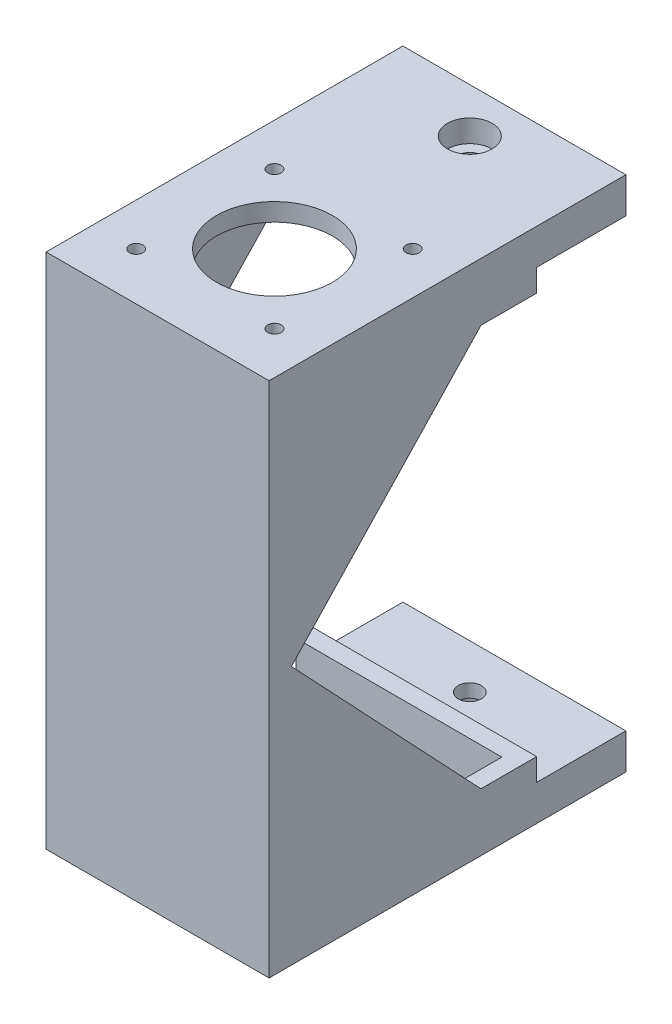
ISO-10303-21;
HEADER;
FILE_DESCRIPTION(('STEP AP214'),'2;1');
FILE_NAME('part.step','',(''),(''),'','','');
FILE_SCHEMA(('AUTOMOTIVE_DESIGN { 1 0 10303 214 1 1 1 1 }'));
ENDSEC;
DATA;
#1=APPLICATION_CONTEXT('core data for automotive mechanical design processes');
#2=APPLICATION_PROTOCOL_DEFINITION('international standard','automotive_design',2000,#1);
#3=PRODUCT_CONTEXT('',#1,'mechanical');
#4=PRODUCT('Part','Part','',(#3));
#5=PRODUCT_RELATED_PRODUCT_CATEGORY('part','',(#4));
#6=PRODUCT_DEFINITION_FORMATION('','',#4);
#7=PRODUCT_DEFINITION_CONTEXT('part definition',#1,'design');
#8=PRODUCT_DEFINITION('design','',#6,#7);
#9=PRODUCT_DEFINITION_SHAPE('','',#8);
#10=(LENGTH_UNIT() NAMED_UNIT(*) SI_UNIT(.MILLI.,.METRE.));
#11=(NAMED_UNIT(*) PLANE_ANGLE_UNIT() SI_UNIT($,.RADIAN.));
#12=(NAMED_UNIT(*) SI_UNIT($,.STERADIAN.) SOLID_ANGLE_UNIT());
#13=UNCERTAINTY_MEASURE_WITH_UNIT(LENGTH_MEASURE(1.E-05),#10,'distance_accuracy_value','');
#14=(GEOMETRIC_REPRESENTATION_CONTEXT(3) GLOBAL_UNCERTAINTY_ASSIGNED_CONTEXT((#13)) GLOBAL_UNIT_ASSIGNED_CONTEXT((#10,
#11,#12)) REPRESENTATION_CONTEXT('',''));
#15=CARTESIAN_POINT('',(0.,0.,0.));
#16=DIRECTION('',(0.,0.,1.));
#17=DIRECTION('',(1.,0.,0.));
#18=AXIS2_PLACEMENT_3D('',#15,#16,#17);
#19=CARTESIAN_POINT('',(25.,-192.,10.));
#20=DIRECTION('',(0.,1.,0.));
#21=DIRECTION('',(0.,0.,1.));
#22=AXIS2_PLACEMENT_3D('',#19,#20,#21);
#23=CYLINDRICAL_SURFACE('',#22,2.6);
#24=CARTESIAN_POINT('',(25.,-100.,10.));
#25=DIRECTION('',(0.,1.,0.));
#26=DIRECTION('',(0.,0.,1.));
#27=AXIS2_PLACEMENT_3D('',#24,#25,#26);
#28=CIRCLE('',#27,2.6);
#29=CARTESIAN_POINT('',(25.,-100.,12.6));
#30=VERTEX_POINT('',#29);
#31=EDGE_CURVE('E353',#30,#30,#28,.T.);
#32=ORIENTED_EDGE('',*,*,#31,.T.);
#33=EDGE_LOOP('',(#32));
#34=FACE_BOUND('',#33,.T.);
#35=CARTESIAN_POINT('',(25.,-103.,10.));
#36=DIRECTION('',(0.,-1.,0.));
#37=DIRECTION('',(0.,0.,-1.));
#38=AXIS2_PLACEMENT_3D('',#35,#36,#37);
#39=CIRCLE('',#38,2.6);
#40=CARTESIAN_POINT('',(25.,-103.,7.4));
#41=VERTEX_POINT('',#40);
#42=EDGE_CURVE('E74',#41,#41,#39,.F.);
#43=ORIENTED_EDGE('',*,*,#42,.F.);
#44=EDGE_LOOP('',(#43));
#45=FACE_BOUND('',#44,.T.);
#46=ADVANCED_FACE('F70',(#34,#45),#23,.F.);
#47=CARTESIAN_POINT('',(25.,50.,10.));
#48=DIRECTION('',(0.,-1.,0.));
#49=DIRECTION('',(0.,0.,-1.));
#50=AXIS2_PLACEMENT_3D('',#47,#48,#49);
#51=CYLINDRICAL_SURFACE('',#50,2.6);
#52=CARTESIAN_POINT('',(25.,0.,10.));
#53=DIRECTION('',(0.,-1.,0.));
#54=DIRECTION('',(0.,0.,-1.));
#55=AXIS2_PLACEMENT_3D('',#52,#53,#54);
#56=CIRCLE('',#55,2.6);
#57=CARTESIAN_POINT('',(25.,0.,7.4));
#58=VERTEX_POINT('',#57);
#59=EDGE_CURVE('E356',#58,#58,#56,.T.);
#60=ORIENTED_EDGE('',*,*,#59,.T.);
#61=EDGE_LOOP('',(#60));
#62=FACE_BOUND('',#61,.T.);
#63=CARTESIAN_POINT('',(25.,3.,10.));
#64=DIRECTION('',(0.,1.,0.));
#65=DIRECTION('',(0.,0.,1.));
#66=AXIS2_PLACEMENT_3D('',#63,#64,#65);
#67=CIRCLE('',#66,2.6);
#68=CARTESIAN_POINT('',(25.,3.,12.6));
#69=VERTEX_POINT('',#68);
#70=EDGE_CURVE('E357',#69,#69,#67,.F.);
#71=ORIENTED_EDGE('',*,*,#70,.F.);
#72=EDGE_LOOP('',(#71));
#73=FACE_BOUND('',#72,.T.);
#74=ADVANCED_FACE('F600',(#62,#73),#51,.F.);
#75=CARTESIAN_POINT('',(0.,-36.,75.));
#76=DIRECTION('',(0.,0.,1.));
#77=DIRECTION('',(1.,0.,0.));
#78=AXIS2_PLACEMENT_3D('',#75,#76,#77);
#79=PLANE('',#78);
#80=DIRECTION('',(0.,1.,0.));
#81=VECTOR('',#80,1.);
#82=CARTESIAN_POINT('',(46.2,0.,75.));
#83=LINE('',#82,#81);
#84=CARTESIAN_POINT('',(46.2,-104.,75.));
#85=VERTEX_POINT('',#84);
#86=CARTESIAN_POINT('',(46.2,-50.,75.));
#87=VERTEX_POINT('',#86);
#88=EDGE_CURVE('E435',#85,#87,#83,.T.);
#89=ORIENTED_EDGE('',*,*,#88,.F.);
#90=DIRECTION('',(-1.,0.,0.));
#91=VECTOR('',#90,1.);
#92=CARTESIAN_POINT('',(50.,-104.,75.));
#93=LINE('',#92,#91);
#94=CARTESIAN_POINT('',(0.,-104.,75.));
#95=VERTEX_POINT('',#94);
#96=EDGE_CURVE('E291',#85,#95,#93,.T.);
#97=ORIENTED_EDGE('',*,*,#96,.T.);
#98=DIRECTION('',(0.,1.,0.));
#99=VECTOR('',#98,1.);
#100=CARTESIAN_POINT('',(0.,-36.,75.));
#101=LINE('',#100,#99);
#102=CARTESIAN_POINT('',(0.,-50.,75.));
#103=VERTEX_POINT('',#102);
#104=EDGE_CURVE('E302',#95,#103,#101,.T.);
#105=ORIENTED_EDGE('',*,*,#104,.T.);
#106=DIRECTION('',(-1.,0.,0.));
#107=VECTOR('',#106,1.);
#108=CARTESIAN_POINT('',(3.80000000000001,-50.,75.));
#109=LINE('',#108,#107);
#110=CARTESIAN_POINT('',(3.80000000000001,-50.,75.));
#111=VERTEX_POINT('',#110);
#112=EDGE_CURVE('E263',#111,#103,#109,.T.);
#113=ORIENTED_EDGE('',*,*,#112,.F.);
#114=DIRECTION('',(0.,1.,0.));
#115=VECTOR('',#114,1.);
#116=CARTESIAN_POINT('',(3.80000000000001,-50.,75.));
#117=LINE('',#116,#115);
#118=CARTESIAN_POINT('',(3.80000000000001,4.,75.));
#119=VERTEX_POINT('',#118);
#120=EDGE_CURVE('E486',#111,#119,#117,.T.);
#121=ORIENTED_EDGE('',*,*,#120,.T.);
#122=DIRECTION('',(1.,0.,0.));
#123=VECTOR('',#122,1.);
#124=CARTESIAN_POINT('',(0.,4.,75.));
#125=LINE('',#124,#123);
#126=CARTESIAN_POINT('',(46.2,4.,75.));
#127=VERTEX_POINT('',#126);
#128=EDGE_CURVE('E284',#119,#127,#125,.T.);
#129=ORIENTED_EDGE('',*,*,#128,.T.);
#130=DIRECTION('',(0.,1.,0.));
#131=VECTOR('',#130,1.);
#132=CARTESIAN_POINT('',(46.2,0.,75.));
#133=LINE('',#132,#131);
#134=EDGE_CURVE('E463',#87,#127,#133,.T.);
#135=ORIENTED_EDGE('',*,*,#134,.F.);
#136=EDGE_LOOP('',(#89,#97,#105,#113,#121,#129,#135));
#137=FACE_BOUND('',#136,.T.);
#138=ADVANCED_FACE('F606',(#137),#79,.F.);
#139=CARTESIAN_POINT('',(50.,-95.,24.));
#140=DIRECTION('',(0.,0.,1.));
#141=DIRECTION('',(1.,0.,0.));
#142=AXIS2_PLACEMENT_3D('',#139,#140,#141);
#143=PLANE('',#142);
#144=DIRECTION('',(-1.,0.,0.));
#145=VECTOR('',#144,1.);
#146=CARTESIAN_POINT('',(50.,-104.,24.));
#147=LINE('',#146,#145);
#148=CARTESIAN_POINT('',(46.2,-104.,24.));
#149=VERTEX_POINT('',#148);
#150=CARTESIAN_POINT('',(0.,-104.,24.));
#151=VERTEX_POINT('',#150);
#152=EDGE_CURVE('E288',#149,#151,#147,.T.);
#153=ORIENTED_EDGE('',*,*,#152,.F.);
#154=DIRECTION('',(0.,-1.,0.));
#155=VECTOR('',#154,1.);
#156=CARTESIAN_POINT('',(46.2,0.,24.));
#157=LINE('',#156,#155);
#158=CARTESIAN_POINT('',(46.2,-95.,24.));
#159=VERTEX_POINT('',#158);
#160=EDGE_CURVE('E88',#159,#149,#157,.T.);
#161=ORIENTED_EDGE('',*,*,#160,.F.);
#162=DIRECTION('',(-1.,0.,0.));
#163=VECTOR('',#162,1.);
#164=CARTESIAN_POINT('',(50.,-95.,24.));
#165=LINE('',#164,#163);
#166=CARTESIAN_POINT('',(0.,-95.,24.));
#167=VERTEX_POINT('',#166);
#168=EDGE_CURVE('E285',#159,#167,#165,.T.);
#169=ORIENTED_EDGE('',*,*,#168,.T.);
#170=DIRECTION('',(0.,1.,0.));
#171=VECTOR('',#170,1.);
#172=CARTESIAN_POINT('',(0.,-95.,24.));
#173=LINE('',#172,#171);
#174=EDGE_CURVE('E273',#151,#167,#173,.T.);
#175=ORIENTED_EDGE('',*,*,#174,.F.);
#176=EDGE_LOOP('',(#153,#161,#169,#175));
#177=FACE_BOUND('',#176,.T.);
#178=ADVANCED_FACE('F649',(#177),#143,.T.);
#179=CARTESIAN_POINT('',(50.,-104.,75.));
#180=DIRECTION('',(0.,1.,0.));
#181=DIRECTION('',(0.,0.,1.));
#182=AXIS2_PLACEMENT_3D('',#179,#180,#181);
#183=PLANE('',#182);
#184=ORIENTED_EDGE('',*,*,#96,.F.);
#185=DIRECTION('',(0.,0.,1.));
#186=VECTOR('',#185,1.);
#187=CARTESIAN_POINT('',(46.2,-104.,0.));
#188=LINE('',#187,#186);
#189=EDGE_CURVE('E96',#149,#85,#188,.T.);
#190=ORIENTED_EDGE('',*,*,#189,.F.);
#191=ORIENTED_EDGE('',*,*,#152,.T.);
#192=DIRECTION('',(0.,0.,-1.));
#193=VECTOR('',#192,1.);
#194=CARTESIAN_POINT('',(0.,-104.,75.));
#195=LINE('',#194,#193);
#196=EDGE_CURVE('E269',#95,#151,#195,.T.);
#197=ORIENTED_EDGE('',*,*,#196,.F.);
#198=EDGE_LOOP('',(#184,#190,#191,#197));
#199=FACE_BOUND('',#198,.T.);
#200=ADVANCED_FACE('F651',(#199),#183,.T.);
#201=CARTESIAN_POINT('',(0.,4.,0.));
#202=DIRECTION('',(0.,-1.,0.));
#203=DIRECTION('',(0.,0.,-1.));
#204=AXIS2_PLACEMENT_3D('',#201,#202,#203);
#205=PLANE('',#204);
#206=CARTESIAN_POINT('',(25.,4.,53.8));
#207=DIRECTION('',(0.,-1.,0.));
#208=DIRECTION('',(0.,0.,-1.));
#209=AXIS2_PLACEMENT_3D('',#206,#207,#208);
#210=CIRCLE('',#209,13.);
#211=CARTESIAN_POINT('',(25.,4.,40.8));
#212=VERTEX_POINT('',#211);
#213=EDGE_CURVE('E402',#212,#212,#210,.T.);
#214=ORIENTED_EDGE('',*,*,#213,.F.);
#215=EDGE_LOOP('',(#214));
#216=FACE_BOUND('',#215,.T.);
#217=CARTESIAN_POINT('',(40.5,4.,69.3));
#218=DIRECTION('',(0.,-1.,0.));
#219=DIRECTION('',(0.,0.,-1.));
#220=AXIS2_PLACEMENT_3D('',#217,#218,#219);
#221=CIRCLE('',#220,1.5);
#222=CARTESIAN_POINT('',(40.5,4.,67.8));
#223=VERTEX_POINT('',#222);
#224=EDGE_CURVE('E410',#223,#223,#221,.T.);
#225=ORIENTED_EDGE('',*,*,#224,.F.);
#226=EDGE_LOOP('',(#225));
#227=FACE_BOUND('',#226,.T.);
#228=CARTESIAN_POINT('',(9.5,4.,69.3));
#229=DIRECTION('',(0.,-1.,0.));
#230=DIRECTION('',(0.,0.,-1.));
#231=AXIS2_PLACEMENT_3D('',#228,#229,#230);
#232=CIRCLE('',#231,1.5);
#233=CARTESIAN_POINT('',(9.5,4.,67.8));
#234=VERTEX_POINT('',#233);
#235=EDGE_CURVE('E394',#234,#234,#232,.T.);
#236=ORIENTED_EDGE('',*,*,#235,.F.);
#237=EDGE_LOOP('',(#236));
#238=FACE_BOUND('',#237,.T.);
#239=CARTESIAN_POINT('',(9.50000000000001,4.,38.3));
#240=DIRECTION('',(0.,-1.,0.));
#241=DIRECTION('',(0.,0.,-1.));
#242=AXIS2_PLACEMENT_3D('',#239,#240,#241);
#243=CIRCLE('',#242,1.5);
#244=CARTESIAN_POINT('',(9.50000000000001,4.,36.8));
#245=VERTEX_POINT('',#244);
#246=EDGE_CURVE('E385',#245,#245,#243,.T.);
#247=ORIENTED_EDGE('',*,*,#246,.F.);
#248=EDGE_LOOP('',(#247));
#249=FACE_BOUND('',#248,.T.);
#250=CARTESIAN_POINT('',(40.5,4.,38.3));
#251=DIRECTION('',(0.,-1.,0.));
#252=DIRECTION('',(0.,0.,-1.));
#253=AXIS2_PLACEMENT_3D('',#250,#251,#252);
#254=CIRCLE('',#253,1.5);
#255=CARTESIAN_POINT('',(40.5,4.,36.8));
#256=VERTEX_POINT('',#255);
#257=EDGE_CURVE('E389',#256,#256,#254,.T.);
#258=ORIENTED_EDGE('',*,*,#257,.F.);
#259=EDGE_LOOP('',(#258));
#260=FACE_BOUND('',#259,.T.);
#261=DIRECTION('',(1.,0.,0.));
#262=VECTOR('',#261,1.);
#263=CARTESIAN_POINT('',(0.,4.,24.));
#264=LINE('',#263,#262);
#265=CARTESIAN_POINT('',(3.8,4.,24.));
#266=VERTEX_POINT('',#265);
#267=CARTESIAN_POINT('',(46.2,4.,24.));
#268=VERTEX_POINT('',#267);
#269=EDGE_CURVE('E12',#266,#268,#264,.T.);
#270=ORIENTED_EDGE('',*,*,#269,.T.);
#271=DIRECTION('',(0.,0.,-1.));
#272=VECTOR('',#271,1.);
#273=CARTESIAN_POINT('',(46.2,4.,0.));
#274=LINE('',#273,#272);
#275=EDGE_CURVE('E460',#127,#268,#274,.T.);
#276=ORIENTED_EDGE('',*,*,#275,.F.);
#277=ORIENTED_EDGE('',*,*,#128,.F.);
#278=DIRECTION('',(0.,0.,-1.));
#279=VECTOR('',#278,1.);
#280=CARTESIAN_POINT('',(3.80000000000001,4.,75.));
#281=LINE('',#280,#279);
#282=EDGE_CURVE('E489',#119,#266,#281,.T.);
#283=ORIENTED_EDGE('',*,*,#282,.T.);
#284=EDGE_LOOP('',(#270,#276,#277,#283));
#285=FACE_BOUND('',#284,.T.);
#286=ADVANCED_FACE('F537',(#216,#227,#238,#249,#260,#285),#205,.T.);
#287=CARTESIAN_POINT('',(0.,-5.,24.));
#288=DIRECTION('',(0.,0.,1.));
#289=DIRECTION('',(1.,0.,0.));
#290=AXIS2_PLACEMENT_3D('',#287,#288,#289);
#291=PLANE('',#290);
#292=DIRECTION('',(1.,0.,0.));
#293=VECTOR('',#292,1.);
#294=CARTESIAN_POINT('',(0.,-5.,24.));
#295=LINE('',#294,#293);
#296=CARTESIAN_POINT('',(3.8,-5.,24.));
#297=VERTEX_POINT('',#296);
#298=CARTESIAN_POINT('',(46.2,-5.,24.));
#299=VERTEX_POINT('',#298);
#300=EDGE_CURVE('E332',#297,#299,#295,.T.);
#301=ORIENTED_EDGE('',*,*,#300,.T.);
#302=DIRECTION('',(0.,-1.,0.));
#303=VECTOR('',#302,1.);
#304=CARTESIAN_POINT('',(46.2,0.,24.));
#305=LINE('',#304,#303);
#306=EDGE_CURVE('E457',#268,#299,#305,.T.);
#307=ORIENTED_EDGE('',*,*,#306,.F.);
#308=ORIENTED_EDGE('',*,*,#269,.F.);
#309=DIRECTION('',(0.,1.,0.));
#310=VECTOR('',#309,1.);
#311=CARTESIAN_POINT('',(3.8,-5.,24.));
#312=LINE('',#311,#310);
#313=EDGE_CURVE('E492',#297,#266,#312,.T.);
#314=ORIENTED_EDGE('',*,*,#313,.F.);
#315=EDGE_LOOP('',(#301,#307,#308,#314));
#316=FACE_BOUND('',#315,.T.);
#317=ADVANCED_FACE('F535',(#316),#291,.T.);
#318=CARTESIAN_POINT('',(0.,8.,0.));
#319=DIRECTION('',(1.,0.,0.));
#320=DIRECTION('',(0.,0.,-1.));
#321=AXIS2_PLACEMENT_3D('',#318,#319,#320);
#322=PLANE('',#321);
#323=DIRECTION('',(0.,0.,-1.));
#324=VECTOR('',#323,1.);
#325=CARTESIAN_POINT('',(0.,-100.,20.));
#326=LINE('',#325,#324);
#327=CARTESIAN_POINT('',(0.,-100.,20.));
#328=VERTEX_POINT('',#327);
#329=CARTESIAN_POINT('',(0.,-100.,0.));
#330=VERTEX_POINT('',#329);
#331=EDGE_CURVE('E262',#328,#330,#326,.T.);
#332=ORIENTED_EDGE('',*,*,#331,.T.);
#333=DIRECTION('',(0.,1.,0.));
#334=VECTOR('',#333,1.);
#335=CARTESIAN_POINT('',(0.,-115.,0.));
#336=LINE('',#335,#334);
#337=CARTESIAN_POINT('',(0.,-108.,0.));
#338=VERTEX_POINT('',#337);
#339=EDGE_CURVE('E228',#338,#330,#336,.T.);
#340=ORIENTED_EDGE('',*,*,#339,.F.);
#341=DIRECTION('',(0.,0.,1.));
#342=VECTOR('',#341,1.);
#343=CARTESIAN_POINT('',(0.,-108.,80.));
#344=LINE('',#343,#342);
#345=CARTESIAN_POINT('',(0.,-108.,80.));
#346=VERTEX_POINT('',#345);
#347=EDGE_CURVE('E237',#338,#346,#344,.T.);
#348=ORIENTED_EDGE('',*,*,#347,.T.);
#349=DIRECTION('',(0.,1.,0.));
#350=VECTOR('',#349,1.);
#351=CARTESIAN_POINT('',(0.,4.,80.));
#352=LINE('',#351,#350);
#353=CARTESIAN_POINT('',(0.,8.,80.));
#354=VERTEX_POINT('',#353);
#355=EDGE_CURVE('E309',#346,#354,#352,.T.);
#356=ORIENTED_EDGE('',*,*,#355,.T.);
#357=DIRECTION('',(0.,0.,1.));
#358=VECTOR('',#357,1.);
#359=CARTESIAN_POINT('',(0.,8.,0.));
#360=LINE('',#359,#358);
#361=CARTESIAN_POINT('',(0.,8.,0.));
#362=VERTEX_POINT('',#361);
#363=EDGE_CURVE('E337',#362,#354,#360,.T.);
#364=ORIENTED_EDGE('',*,*,#363,.F.);
#365=DIRECTION('',(0.,-1.,0.));
#366=VECTOR('',#365,1.);
#367=CARTESIAN_POINT('',(0.,15.,0.));
#368=LINE('',#367,#366);
#369=CARTESIAN_POINT('',(0.,0.,0.));
#370=VERTEX_POINT('',#369);
#371=EDGE_CURVE('E565',#362,#370,#368,.T.);
#372=ORIENTED_EDGE('',*,*,#371,.T.);
#373=DIRECTION('',(0.,0.,1.));
#374=VECTOR('',#373,1.);
#375=CARTESIAN_POINT('',(0.,0.,0.));
#376=LINE('',#375,#374);
#377=CARTESIAN_POINT('',(0.,0.,20.));
#378=VERTEX_POINT('',#377);
#379=EDGE_CURVE('E336',#370,#378,#376,.T.);
#380=ORIENTED_EDGE('',*,*,#379,.T.);
#381=DIRECTION('',(0.,1.,0.));
#382=VECTOR('',#381,1.);
#383=CARTESIAN_POINT('',(0.,-5.,20.));
#384=LINE('',#383,#382);
#385=CARTESIAN_POINT('',(0.,-5.,20.));
#386=VERTEX_POINT('',#385);
#387=EDGE_CURVE('E312',#386,#378,#384,.T.);
#388=ORIENTED_EDGE('',*,*,#387,.F.);
#389=DIRECTION('',(0.,0.,1.));
#390=VECTOR('',#389,1.);
#391=CARTESIAN_POINT('',(0.,-5.,20.));
#392=LINE('',#391,#390);
#393=CARTESIAN_POINT('',(0.,-5.,32.5));
#394=VERTEX_POINT('',#393);
#395=EDGE_CURVE('E320',#386,#394,#392,.T.);
#396=ORIENTED_EDGE('',*,*,#395,.T.);
#397=DIRECTION('',(0.,-0.727013152549817,0.686623532963716));
#398=VECTOR('',#397,1.);
#399=CARTESIAN_POINT('',(0.,-5.,32.5));
#400=LINE('',#399,#398);
#401=EDGE_CURVE('E474',#394,#103,#400,.T.);
#402=ORIENTED_EDGE('',*,*,#401,.T.);
#403=ORIENTED_EDGE('',*,*,#104,.F.);
#404=ORIENTED_EDGE('',*,*,#196,.T.);
#405=ORIENTED_EDGE('',*,*,#174,.T.);
#406=DIRECTION('',(0.,0.,-1.));
#407=VECTOR('',#406,1.);
#408=CARTESIAN_POINT('',(0.,-95.,20.));
#409=LINE('',#408,#407);
#410=CARTESIAN_POINT('',(0.,-95.,20.));
#411=VERTEX_POINT('',#410);
#412=EDGE_CURVE('E277',#167,#411,#409,.T.);
#413=ORIENTED_EDGE('',*,*,#412,.T.);
#414=DIRECTION('',(0.,-1.,0.));
#415=VECTOR('',#414,1.);
#416=CARTESIAN_POINT('',(0.,-100.,20.));
#417=LINE('',#416,#415);
#418=EDGE_CURVE('E258',#411,#328,#417,.T.);
#419=ORIENTED_EDGE('',*,*,#418,.T.);
#420=EDGE_LOOP('',(#332,#340,#348,#356,#364,#372,#380,#388,#396,#402,#403,#404,#405,#413,#419));
#421=FACE_BOUND('',#420,.T.);
#422=ADVANCED_FACE('F72',(#421),#322,.F.);
#423=CARTESIAN_POINT('',(50.,8.,0.));
#424=DIRECTION('',(-1.,0.,0.));
#425=DIRECTION('',(0.,0.,1.));
#426=AXIS2_PLACEMENT_3D('',#423,#424,#425);
#427=PLANE('',#426);
#428=DIRECTION('',(0.,0.,1.));
#429=VECTOR('',#428,1.);
#430=CARTESIAN_POINT('',(50.,-108.,80.));
#431=LINE('',#430,#429);
#432=CARTESIAN_POINT('',(50.,-108.,0.));
#433=VERTEX_POINT('',#432);
#434=CARTESIAN_POINT('',(50.,-108.,80.));
#435=VERTEX_POINT('',#434);
#436=EDGE_CURVE('E235',#433,#435,#431,.T.);
#437=ORIENTED_EDGE('',*,*,#436,.F.);
#438=DIRECTION('',(0.,1.,0.));
#439=VECTOR('',#438,1.);
#440=CARTESIAN_POINT('',(50.,-115.,0.));
#441=LINE('',#440,#439);
#442=CARTESIAN_POINT('',(50.,-100.,0.));
#443=VERTEX_POINT('',#442);
#444=EDGE_CURVE('E216',#433,#443,#441,.T.);
#445=ORIENTED_EDGE('',*,*,#444,.T.);
#446=DIRECTION('',(0.,0.,-1.));
#447=VECTOR('',#446,1.);
#448=CARTESIAN_POINT('',(50.,-100.,20.));
#449=LINE('',#448,#447);
#450=CARTESIAN_POINT('',(50.,-100.,20.));
#451=VERTEX_POINT('',#450);
#452=EDGE_CURVE('E247',#451,#443,#449,.T.);
#453=ORIENTED_EDGE('',*,*,#452,.F.);
#454=DIRECTION('',(0.,-1.,0.));
#455=VECTOR('',#454,1.);
#456=CARTESIAN_POINT('',(50.,-100.,20.));
#457=LINE('',#456,#455);
#458=CARTESIAN_POINT('',(50.,-95.,20.));
#459=VERTEX_POINT('',#458);
#460=EDGE_CURVE('E254',#459,#451,#457,.T.);
#461=ORIENTED_EDGE('',*,*,#460,.F.);
#462=DIRECTION('',(0.,0.,-1.));
#463=VECTOR('',#462,1.);
#464=CARTESIAN_POINT('',(50.,-95.,20.));
#465=LINE('',#464,#463);
#466=CARTESIAN_POINT('',(50.,-95.,32.5));
#467=VERTEX_POINT('',#466);
#468=EDGE_CURVE('E246',#467,#459,#465,.T.);
#469=ORIENTED_EDGE('',*,*,#468,.F.);
#470=DIRECTION('',(0.,0.727013152549818,0.686623532963716));
#471=VECTOR('',#470,1.);
#472=CARTESIAN_POINT('',(50.,-61.0114192495921,64.6003262642741));
#473=LINE('',#472,#471);
#474=CARTESIAN_POINT('',(50.,-50.,75.));
#475=VERTEX_POINT('',#474);
#476=EDGE_CURVE('E430',#467,#475,#473,.T.);
#477=ORIENTED_EDGE('',*,*,#476,.T.);
#478=DIRECTION('',(0.,0.727013152549818,-0.686623532963716));
#479=VECTOR('',#478,1.);
#480=CARTESIAN_POINT('',(50.,13.8662316476346,14.6818923327896));
#481=LINE('',#480,#479);
#482=CARTESIAN_POINT('',(50.,-5.,32.5));
#483=VERTEX_POINT('',#482);
#484=EDGE_CURVE('E434',#475,#483,#481,.T.);
#485=ORIENTED_EDGE('',*,*,#484,.T.);
#486=DIRECTION('',(0.,0.,1.));
#487=VECTOR('',#486,1.);
#488=CARTESIAN_POINT('',(50.,-5.,20.));
#489=LINE('',#488,#487);
#490=CARTESIAN_POINT('',(50.,-5.,20.));
#491=VERTEX_POINT('',#490);
#492=EDGE_CURVE('E329',#491,#483,#489,.T.);
#493=ORIENTED_EDGE('',*,*,#492,.F.);
#494=DIRECTION('',(0.,1.,0.));
#495=VECTOR('',#494,1.);
#496=CARTESIAN_POINT('',(50.,-5.,20.));
#497=LINE('',#496,#495);
#498=CARTESIAN_POINT('',(50.,0.,20.));
#499=VERTEX_POINT('',#498);
#500=EDGE_CURVE('E316',#491,#499,#497,.T.);
#501=ORIENTED_EDGE('',*,*,#500,.T.);
#502=DIRECTION('',(0.,0.,-1.));
#503=VECTOR('',#502,1.);
#504=CARTESIAN_POINT('',(50.,0.,0.));
#505=LINE('',#504,#503);
#506=CARTESIAN_POINT('',(50.,0.,0.));
#507=VERTEX_POINT('',#506);
#508=EDGE_CURVE('E340',#499,#507,#505,.T.);
#509=ORIENTED_EDGE('',*,*,#508,.T.);
#510=DIRECTION('',(0.,-1.,0.));
#511=VECTOR('',#510,1.);
#512=CARTESIAN_POINT('',(50.,15.,0.));
#513=LINE('',#512,#511);
#514=CARTESIAN_POINT('',(50.,8.,0.));
#515=VERTEX_POINT('',#514);
#516=EDGE_CURVE('E239',#515,#507,#513,.T.);
#517=ORIENTED_EDGE('',*,*,#516,.F.);
#518=DIRECTION('',(0.,0.,-1.));
#519=VECTOR('',#518,1.);
#520=CARTESIAN_POINT('',(50.,8.,0.));
#521=LINE('',#520,#519);
#522=CARTESIAN_POINT('',(50.,8.,80.));
#523=VERTEX_POINT('',#522);
#524=EDGE_CURVE('E80',#523,#515,#521,.T.);
#525=ORIENTED_EDGE('',*,*,#524,.F.);
#526=DIRECTION('',(0.,1.,0.));
#527=VECTOR('',#526,1.);
#528=CARTESIAN_POINT('',(50.,4.,80.));
#529=LINE('',#528,#527);
#530=EDGE_CURVE('E243',#435,#523,#529,.T.);
#531=ORIENTED_EDGE('',*,*,#530,.F.);
#532=EDGE_LOOP('',(#437,#445,#453,#461,#469,#477,#485,#493,#501,#509,#517,#525,#531));
#533=FACE_BOUND('',#532,.T.);
#534=ADVANCED_FACE('F241',(#533),#427,.F.);
#535=CARTESIAN_POINT('',(0.,8.,0.));
#536=DIRECTION('',(0.,1.,0.));
#537=DIRECTION('',(0.,0.,1.));
#538=AXIS2_PLACEMENT_3D('',#535,#536,#537);
#539=PLANE('',#538);
#540=DIRECTION('',(1.,0.,0.));
#541=VECTOR('',#540,1.);
#542=CARTESIAN_POINT('',(0.,8.,0.));
#543=LINE('',#542,#541);
#544=EDGE_CURVE('E569',#362,#515,#543,.T.);
#545=ORIENTED_EDGE('',*,*,#544,.F.);
#546=ORIENTED_EDGE('',*,*,#363,.T.);
#547=DIRECTION('',(1.,0.,0.));
#548=VECTOR('',#547,1.);
#549=CARTESIAN_POINT('',(0.,8.,80.));
#550=LINE('',#549,#548);
#551=EDGE_CURVE('E305',#354,#523,#550,.T.);
#552=ORIENTED_EDGE('',*,*,#551,.T.);
#553=ORIENTED_EDGE('',*,*,#524,.T.);
#554=EDGE_LOOP('',(#545,#546,#552,#553));
#555=FACE_BOUND('',#554,.T.);
#556=CARTESIAN_POINT('',(25.,8.,10.));
#557=DIRECTION('',(0.,1.,0.));
#558=DIRECTION('',(0.,0.,1.));
#559=AXIS2_PLACEMENT_3D('',#556,#557,#558);
#560=CIRCLE('',#559,5.);
#561=CARTESIAN_POINT('',(25.,8.,15.));
#562=VERTEX_POINT('',#561);
#563=EDGE_CURVE('E365',#562,#562,#560,.T.);
#564=ORIENTED_EDGE('',*,*,#563,.F.);
#565=EDGE_LOOP('',(#564));
#566=FACE_BOUND('',#565,.T.);
#567=CARTESIAN_POINT('',(40.5,8.,69.3));
#568=DIRECTION('',(0.,-1.,0.));
#569=DIRECTION('',(0.,0.,-1.));
#570=AXIS2_PLACEMENT_3D('',#567,#568,#569);
#571=CIRCLE('',#570,1.5);
#572=CARTESIAN_POINT('',(40.5,8.,67.8));
#573=VERTEX_POINT('',#572);
#574=EDGE_CURVE('E384',#573,#573,#571,.T.);
#575=ORIENTED_EDGE('',*,*,#574,.T.);
#576=EDGE_LOOP('',(#575));
#577=FACE_BOUND('',#576,.T.);
#578=CARTESIAN_POINT('',(25.,8.,53.8));
#579=DIRECTION('',(0.,-1.,0.));
#580=DIRECTION('',(0.,0.,-1.));
#581=AXIS2_PLACEMENT_3D('',#578,#579,#580);
#582=CIRCLE('',#581,13.);
#583=CARTESIAN_POINT('',(25.,8.,40.8));
#584=VERTEX_POINT('',#583);
#585=EDGE_CURVE('E406',#584,#584,#582,.T.);
#586=ORIENTED_EDGE('',*,*,#585,.T.);
#587=EDGE_LOOP('',(#586));
#588=FACE_BOUND('',#587,.T.);
#589=CARTESIAN_POINT('',(9.5,8.,69.3));
#590=DIRECTION('',(0.,-1.,0.));
#591=DIRECTION('',(0.,0.,-1.));
#592=AXIS2_PLACEMENT_3D('',#589,#590,#591);
#593=CIRCLE('',#592,1.5);
#594=CARTESIAN_POINT('',(9.5,8.,67.8));
#595=VERTEX_POINT('',#594);
#596=EDGE_CURVE('E398',#595,#595,#593,.T.);
#597=ORIENTED_EDGE('',*,*,#596,.T.);
#598=EDGE_LOOP('',(#597));
#599=FACE_BOUND('',#598,.T.);
#600=CARTESIAN_POINT('',(9.50000000000001,8.,38.3));
#601=DIRECTION('',(0.,-1.,0.));
#602=DIRECTION('',(0.,0.,-1.));
#603=AXIS2_PLACEMENT_3D('',#600,#601,#602);
#604=CIRCLE('',#603,1.5);
#605=CARTESIAN_POINT('',(9.50000000000001,8.,36.8));
#606=VERTEX_POINT('',#605);
#607=EDGE_CURVE('E390',#606,#606,#604,.T.);
#608=ORIENTED_EDGE('',*,*,#607,.T.);
#609=EDGE_LOOP('',(#608));
#610=FACE_BOUND('',#609,.T.);
#611=CARTESIAN_POINT('',(40.5,8.,38.3));
#612=DIRECTION('',(0.,-1.,0.));
#613=DIRECTION('',(0.,0.,-1.));
#614=AXIS2_PLACEMENT_3D('',#611,#612,#613);
#615=CIRCLE('',#614,1.5);
#616=CARTESIAN_POINT('',(40.5,8.,36.8));
#617=VERTEX_POINT('',#616);
#618=EDGE_CURVE('E417',#617,#617,#615,.T.);
#619=ORIENTED_EDGE('',*,*,#618,.T.);
#620=EDGE_LOOP('',(#619));
#621=FACE_BOUND('',#620,.T.);
#622=ADVANCED_FACE('F675',(#555,#566,#577,#588,#599,#610,#621),#539,.T.);
#623=CARTESIAN_POINT('',(0.,0.,0.));
#624=DIRECTION('',(0.,1.,0.));
#625=DIRECTION('',(0.,0.,1.));
#626=AXIS2_PLACEMENT_3D('',#623,#624,#625);
#627=PLANE('',#626);
#628=ORIENTED_EDGE('',*,*,#59,.F.);
#629=EDGE_LOOP('',(#628));
#630=FACE_BOUND('',#629,.T.);
#631=ORIENTED_EDGE('',*,*,#379,.F.);
#632=DIRECTION('',(-1.,0.,0.));
#633=VECTOR('',#632,1.);
#634=CARTESIAN_POINT('',(50.,0.,0.));
#635=LINE('',#634,#633);
#636=EDGE_CURVE('E381',#507,#370,#635,.T.);
#637=ORIENTED_EDGE('',*,*,#636,.F.);
#638=ORIENTED_EDGE('',*,*,#508,.F.);
#639=DIRECTION('',(1.,0.,0.));
#640=VECTOR('',#639,1.);
#641=CARTESIAN_POINT('',(0.,0.,20.));
#642=LINE('',#641,#640);
#643=EDGE_CURVE('E346',#378,#499,#642,.T.);
#644=ORIENTED_EDGE('',*,*,#643,.F.);
#645=EDGE_LOOP('',(#631,#637,#638,#644));
#646=FACE_BOUND('',#645,.T.);
#647=ADVANCED_FACE('F562',(#630,#646),#627,.F.);
#648=CARTESIAN_POINT('',(0.,-5.,20.));
#649=DIRECTION('',(0.,0.,1.));
#650=DIRECTION('',(1.,0.,0.));
#651=AXIS2_PLACEMENT_3D('',#648,#649,#650);
#652=PLANE('',#651);
#653=ORIENTED_EDGE('',*,*,#387,.T.);
#654=ORIENTED_EDGE('',*,*,#643,.T.);
#655=ORIENTED_EDGE('',*,*,#500,.F.);
#656=DIRECTION('',(1.,0.,0.));
#657=VECTOR('',#656,1.);
#658=CARTESIAN_POINT('',(0.,-5.,20.));
#659=LINE('',#658,#657);
#660=EDGE_CURVE('E326',#386,#491,#659,.T.);
#661=ORIENTED_EDGE('',*,*,#660,.F.);
#662=EDGE_LOOP('',(#653,#654,#655,#661));
#663=FACE_BOUND('',#662,.T.);
#664=ADVANCED_FACE('F558',(#663),#652,.F.);
#665=CARTESIAN_POINT('',(0.,-5.,0.));
#666=DIRECTION('',(0.,-1.,0.));
#667=DIRECTION('',(0.,0.,-1.));
#668=AXIS2_PLACEMENT_3D('',#665,#666,#667);
#669=PLANE('',#668);
#670=ORIENTED_EDGE('',*,*,#300,.F.);
#671=DIRECTION('',(0.,0.,1.));
#672=VECTOR('',#671,1.);
#673=CARTESIAN_POINT('',(3.8,-5.,24.));
#674=LINE('',#673,#672);
#675=CARTESIAN_POINT('',(3.8,-5.,32.5));
#676=VERTEX_POINT('',#675);
#677=EDGE_CURVE('E478',#297,#676,#674,.T.);
#678=ORIENTED_EDGE('',*,*,#677,.T.);
#679=DIRECTION('',(-1.,0.,0.));
#680=VECTOR('',#679,1.);
#681=CARTESIAN_POINT('',(3.8,-5.,32.5));
#682=LINE('',#681,#680);
#683=EDGE_CURVE('E496',#676,#394,#682,.T.);
#684=ORIENTED_EDGE('',*,*,#683,.T.);
#685=ORIENTED_EDGE('',*,*,#395,.F.);
#686=ORIENTED_EDGE('',*,*,#660,.T.);
#687=ORIENTED_EDGE('',*,*,#492,.T.);
#688=DIRECTION('',(1.,0.,0.));
#689=VECTOR('',#688,1.);
#690=CARTESIAN_POINT('',(46.2,-5.,32.5));
#691=LINE('',#690,#689);
#692=CARTESIAN_POINT('',(46.2,-5.,32.5));
#693=VERTEX_POINT('',#692);
#694=EDGE_CURVE('E466',#693,#483,#691,.T.);
#695=ORIENTED_EDGE('',*,*,#694,.F.);
#696=DIRECTION('',(0.,0.,-1.));
#697=VECTOR('',#696,1.);
#698=CARTESIAN_POINT('',(46.2,-5.,0.));
#699=LINE('',#698,#697);
#700=EDGE_CURVE('E453',#693,#299,#699,.T.);
#701=ORIENTED_EDGE('',*,*,#700,.T.);
#702=EDGE_LOOP('',(#670,#678,#684,#685,#686,#687,#695,#701));
#703=FACE_BOUND('',#702,.T.);
#704=ADVANCED_FACE('F527',(#703),#669,.T.);
#705=CARTESIAN_POINT('',(0.,4.,80.));
#706=DIRECTION('',(0.,0.,1.));
#707=DIRECTION('',(1.,0.,0.));
#708=AXIS2_PLACEMENT_3D('',#705,#706,#707);
#709=PLANE('',#708);
#710=ORIENTED_EDGE('',*,*,#551,.F.);
#711=ORIENTED_EDGE('',*,*,#355,.F.);
#712=DIRECTION('',(-1.,0.,0.));
#713=VECTOR('',#712,1.);
#714=CARTESIAN_POINT('',(50.,-108.,80.));
#715=LINE('',#714,#713);
#716=EDGE_CURVE('E294',#435,#346,#715,.T.);
#717=ORIENTED_EDGE('',*,*,#716,.F.);
#718=ORIENTED_EDGE('',*,*,#530,.T.);
#719=EDGE_LOOP('',(#710,#711,#717,#718));
#720=FACE_BOUND('',#719,.T.);
#721=ADVANCED_FACE('F665',(#720),#709,.T.);
#722=CARTESIAN_POINT('',(50.,-100.,20.));
#723=DIRECTION('',(0.,0.,-1.));
#724=DIRECTION('',(-1.,0.,0.));
#725=AXIS2_PLACEMENT_3D('',#722,#723,#724);
#726=PLANE('',#725);
#727=ORIENTED_EDGE('',*,*,#418,.F.);
#728=DIRECTION('',(-1.,0.,0.));
#729=VECTOR('',#728,1.);
#730=CARTESIAN_POINT('',(50.,-95.,20.));
#731=LINE('',#730,#729);
#732=EDGE_CURVE('E281',#459,#411,#731,.T.);
#733=ORIENTED_EDGE('',*,*,#732,.F.);
#734=ORIENTED_EDGE('',*,*,#460,.T.);
#735=DIRECTION('',(-1.,0.,0.));
#736=VECTOR('',#735,1.);
#737=CARTESIAN_POINT('',(50.,-100.,20.));
#738=LINE('',#737,#736);
#739=EDGE_CURVE('E252',#451,#328,#738,.T.);
#740=ORIENTED_EDGE('',*,*,#739,.T.);
#741=EDGE_LOOP('',(#727,#733,#734,#740));
#742=FACE_BOUND('',#741,.T.);
#743=ADVANCED_FACE('F510',(#742),#726,.T.);
#744=CARTESIAN_POINT('',(50.,-95.,20.));
#745=DIRECTION('',(0.,1.,0.));
#746=DIRECTION('',(0.,0.,1.));
#747=AXIS2_PLACEMENT_3D('',#744,#745,#746);
#748=PLANE('',#747);
#749=ORIENTED_EDGE('',*,*,#412,.F.);
#750=ORIENTED_EDGE('',*,*,#168,.F.);
#751=DIRECTION('',(0.,0.,1.));
#752=VECTOR('',#751,1.);
#753=CARTESIAN_POINT('',(46.2,-95.,0.));
#754=LINE('',#753,#752);
#755=CARTESIAN_POINT('',(46.2,-95.,32.5));
#756=VERTEX_POINT('',#755);
#757=EDGE_CURVE('E421',#159,#756,#754,.T.);
#758=ORIENTED_EDGE('',*,*,#757,.T.);
#759=DIRECTION('',(1.,0.,0.));
#760=VECTOR('',#759,1.);
#761=CARTESIAN_POINT('',(46.2,-95.,32.5));
#762=LINE('',#761,#760);
#763=EDGE_CURVE('E425',#756,#467,#762,.T.);
#764=ORIENTED_EDGE('',*,*,#763,.T.);
#765=ORIENTED_EDGE('',*,*,#468,.T.);
#766=ORIENTED_EDGE('',*,*,#732,.T.);
#767=EDGE_LOOP('',(#749,#750,#758,#764,#765,#766));
#768=FACE_BOUND('',#767,.T.);
#769=ADVANCED_FACE('F514',(#768),#748,.T.);
#770=CARTESIAN_POINT('',(50.,-108.,80.));
#771=DIRECTION('',(0.,-1.,0.));
#772=DIRECTION('',(0.,0.,-1.));
#773=AXIS2_PLACEMENT_3D('',#770,#771,#772);
#774=PLANE('',#773);
#775=DIRECTION('',(-1.,0.,0.));
#776=VECTOR('',#775,1.);
#777=CARTESIAN_POINT('',(50.,-108.,0.));
#778=LINE('',#777,#776);
#779=EDGE_CURVE('E219',#433,#338,#778,.T.);
#780=ORIENTED_EDGE('',*,*,#779,.F.);
#781=ORIENTED_EDGE('',*,*,#436,.T.);
#782=ORIENTED_EDGE('',*,*,#716,.T.);
#783=ORIENTED_EDGE('',*,*,#347,.F.);
#784=EDGE_LOOP('',(#780,#781,#782,#783));
#785=FACE_BOUND('',#784,.T.);
#786=CARTESIAN_POINT('',(25.,-108.,10.));
#787=DIRECTION('',(0.,-1.,0.));
#788=DIRECTION('',(0.,0.,-1.));
#789=AXIS2_PLACEMENT_3D('',#786,#787,#788);
#790=CIRCLE('',#789,5.);
#791=CARTESIAN_POINT('',(25.,-108.,5.));
#792=VERTEX_POINT('',#791);
#793=EDGE_CURVE('E373',#792,#792,#790,.T.);
#794=ORIENTED_EDGE('',*,*,#793,.F.);
#795=EDGE_LOOP('',(#794));
#796=FACE_BOUND('',#795,.T.);
#797=ADVANCED_FACE('F232',(#785,#796),#774,.T.);
#798=CARTESIAN_POINT('',(50.,-100.,20.));
#799=DIRECTION('',(0.,1.,0.));
#800=DIRECTION('',(0.,0.,1.));
#801=AXIS2_PLACEMENT_3D('',#798,#799,#800);
#802=PLANE('',#801);
#803=ORIENTED_EDGE('',*,*,#31,.F.);
#804=EDGE_LOOP('',(#803));
#805=FACE_BOUND('',#804,.T.);
#806=DIRECTION('',(-1.,0.,0.));
#807=VECTOR('',#806,1.);
#808=CARTESIAN_POINT('',(50.,-100.,0.));
#809=LINE('',#808,#807);
#810=EDGE_CURVE('E222',#443,#330,#809,.T.);
#811=ORIENTED_EDGE('',*,*,#810,.T.);
#812=ORIENTED_EDGE('',*,*,#331,.F.);
#813=ORIENTED_EDGE('',*,*,#739,.F.);
#814=ORIENTED_EDGE('',*,*,#452,.T.);
#815=EDGE_LOOP('',(#811,#812,#813,#814));
#816=FACE_BOUND('',#815,.T.);
#817=ADVANCED_FACE('F589',(#805,#816),#802,.T.);
#818=CARTESIAN_POINT('',(3.8,-5.,32.5));
#819=DIRECTION('',(0.,-0.686623532963716,-0.727013152549817));
#820=DIRECTION('',(0.,0.727013152549817,-0.686623532963716));
#821=AXIS2_PLACEMENT_3D('',#818,#819,#820);
#822=PLANE('',#821);
#823=ORIENTED_EDGE('',*,*,#401,.F.);
#824=ORIENTED_EDGE('',*,*,#683,.F.);
#825=DIRECTION('',(0.,-0.727013152549817,0.686623532963716));
#826=VECTOR('',#825,1.);
#827=CARTESIAN_POINT('',(3.8,-5.,32.5));
#828=LINE('',#827,#826);
#829=EDGE_CURVE('E482',#676,#111,#828,.T.);
#830=ORIENTED_EDGE('',*,*,#829,.T.);
#831=ORIENTED_EDGE('',*,*,#112,.T.);
#832=EDGE_LOOP('',(#823,#824,#830,#831));
#833=FACE_BOUND('',#832,.T.);
#834=ADVANCED_FACE('F548',(#833),#822,.T.);
#835=CARTESIAN_POINT('',(3.8,0.,0.));
#836=DIRECTION('',(-1.,0.,0.));
#837=DIRECTION('',(0.,0.,1.));
#838=AXIS2_PLACEMENT_3D('',#835,#836,#837);
#839=PLANE('',#838);
#840=ORIENTED_EDGE('',*,*,#677,.F.);
#841=ORIENTED_EDGE('',*,*,#313,.T.);
#842=ORIENTED_EDGE('',*,*,#282,.F.);
#843=ORIENTED_EDGE('',*,*,#120,.F.);
#844=ORIENTED_EDGE('',*,*,#829,.F.);
#845=EDGE_LOOP('',(#840,#841,#842,#843,#844));
#846=FACE_BOUND('',#845,.T.);
#847=ADVANCED_FACE('F543',(#846),#839,.F.);
#848=CARTESIAN_POINT('',(46.2,13.8662316476346,14.6818923327896));
#849=DIRECTION('',(0.,-0.686623532963716,-0.727013152549818));
#850=DIRECTION('',(0.,0.727013152549818,-0.686623532963716));
#851=AXIS2_PLACEMENT_3D('',#848,#849,#850);
#852=PLANE('',#851);
#853=ORIENTED_EDGE('',*,*,#484,.F.);
#854=DIRECTION('',(1.,0.,0.));
#855=VECTOR('',#854,1.);
#856=CARTESIAN_POINT('',(46.2,-50.,75.));
#857=LINE('',#856,#855);
#858=EDGE_CURVE('E470',#87,#475,#857,.T.);
#859=ORIENTED_EDGE('',*,*,#858,.F.);
#860=DIRECTION('',(0.,0.727013152549818,-0.686623532963716));
#861=VECTOR('',#860,1.);
#862=CARTESIAN_POINT('',(46.2,13.8662316476346,14.6818923327896));
#863=LINE('',#862,#861);
#864=EDGE_CURVE('E449',#87,#693,#863,.T.);
#865=ORIENTED_EDGE('',*,*,#864,.T.);
#866=ORIENTED_EDGE('',*,*,#694,.T.);
#867=EDGE_LOOP('',(#853,#859,#865,#866));
#868=FACE_BOUND('',#867,.T.);
#869=ADVANCED_FACE('F522',(#868),#852,.T.);
#870=CARTESIAN_POINT('',(46.2,0.,0.));
#871=DIRECTION('',(1.,0.,0.));
#872=DIRECTION('',(0.,0.,-1.));
#873=AXIS2_PLACEMENT_3D('',#870,#871,#872);
#874=PLANE('',#873);
#875=ORIENTED_EDGE('',*,*,#864,.F.);
#876=ORIENTED_EDGE('',*,*,#134,.T.);
#877=ORIENTED_EDGE('',*,*,#275,.T.);
#878=ORIENTED_EDGE('',*,*,#306,.T.);
#879=ORIENTED_EDGE('',*,*,#700,.F.);
#880=EDGE_LOOP('',(#875,#876,#877,#878,#879));
#881=FACE_BOUND('',#880,.T.);
#882=ADVANCED_FACE('F529',(#881),#874,.F.);
#883=CARTESIAN_POINT('',(46.2,-61.0114192495921,64.6003262642741));
#884=DIRECTION('',(0.,0.686623532963716,-0.727013152549818));
#885=DIRECTION('',(0.,0.727013152549818,0.686623532963716));
#886=AXIS2_PLACEMENT_3D('',#883,#884,#885);
#887=PLANE('',#886);
#888=ORIENTED_EDGE('',*,*,#476,.F.);
#889=ORIENTED_EDGE('',*,*,#763,.F.);
#890=DIRECTION('',(0.,0.727013152549818,0.686623532963716));
#891=VECTOR('',#890,1.);
#892=CARTESIAN_POINT('',(46.2,-61.0114192495921,64.6003262642741));
#893=LINE('',#892,#891);
#894=EDGE_CURVE('E429',#756,#87,#893,.T.);
#895=ORIENTED_EDGE('',*,*,#894,.T.);
#896=ORIENTED_EDGE('',*,*,#858,.T.);
#897=EDGE_LOOP('',(#888,#889,#895,#896));
#898=FACE_BOUND('',#897,.T.);
#899=ADVANCED_FACE('F519',(#898),#887,.T.);
#900=CARTESIAN_POINT('',(46.2,0.,0.));
#901=DIRECTION('',(1.,0.,0.));
#902=DIRECTION('',(0.,0.,-1.));
#903=AXIS2_PLACEMENT_3D('',#900,#901,#902);
#904=PLANE('',#903);
#905=ORIENTED_EDGE('',*,*,#757,.F.);
#906=ORIENTED_EDGE('',*,*,#160,.T.);
#907=ORIENTED_EDGE('',*,*,#189,.T.);
#908=ORIENTED_EDGE('',*,*,#88,.T.);
#909=ORIENTED_EDGE('',*,*,#894,.F.);
#910=EDGE_LOOP('',(#905,#906,#907,#908,#909));
#911=FACE_BOUND('',#910,.T.);
#912=ADVANCED_FACE('F634',(#911),#904,.F.);
#913=CARTESIAN_POINT('',(40.5,8.,38.3));
#914=DIRECTION('',(0.,-1.,0.));
#915=DIRECTION('',(0.,0.,-1.));
#916=AXIS2_PLACEMENT_3D('',#913,#914,#915);
#917=CYLINDRICAL_SURFACE('',#916,1.5);
#918=ORIENTED_EDGE('',*,*,#618,.F.);
#919=EDGE_LOOP('',(#918));
#920=FACE_BOUND('',#919,.T.);
#921=ORIENTED_EDGE('',*,*,#257,.T.);
#922=EDGE_LOOP('',(#921));
#923=FACE_BOUND('',#922,.T.);
#924=ADVANCED_FACE('F618',(#920,#923),#917,.F.);
#925=CARTESIAN_POINT('',(9.50000000000001,8.,38.3));
#926=DIRECTION('',(0.,-1.,0.));
#927=DIRECTION('',(0.,0.,-1.));
#928=AXIS2_PLACEMENT_3D('',#925,#926,#927);
#929=CYLINDRICAL_SURFACE('',#928,1.5);
#930=ORIENTED_EDGE('',*,*,#607,.F.);
#931=EDGE_LOOP('',(#930));
#932=FACE_BOUND('',#931,.T.);
#933=ORIENTED_EDGE('',*,*,#246,.T.);
#934=EDGE_LOOP('',(#933));
#935=FACE_BOUND('',#934,.T.);
#936=ADVANCED_FACE('F614',(#932,#935),#929,.F.);
#937=CARTESIAN_POINT('',(9.5,8.,69.3));
#938=DIRECTION('',(0.,-1.,0.));
#939=DIRECTION('',(0.,0.,-1.));
#940=AXIS2_PLACEMENT_3D('',#937,#938,#939);
#941=CYLINDRICAL_SURFACE('',#940,1.5);
#942=ORIENTED_EDGE('',*,*,#596,.F.);
#943=EDGE_LOOP('',(#942));
#944=FACE_BOUND('',#943,.T.);
#945=ORIENTED_EDGE('',*,*,#235,.T.);
#946=EDGE_LOOP('',(#945));
#947=FACE_BOUND('',#946,.T.);
#948=ADVANCED_FACE('F617',(#944,#947),#941,.F.);
#949=CARTESIAN_POINT('',(25.,8.,53.8));
#950=DIRECTION('',(0.,-1.,0.));
#951=DIRECTION('',(0.,0.,-1.));
#952=AXIS2_PLACEMENT_3D('',#949,#950,#951);
#953=CYLINDRICAL_SURFACE('',#952,13.);
#954=ORIENTED_EDGE('',*,*,#585,.F.);
#955=EDGE_LOOP('',(#954));
#956=FACE_BOUND('',#955,.T.);
#957=ORIENTED_EDGE('',*,*,#213,.T.);
#958=EDGE_LOOP('',(#957));
#959=FACE_BOUND('',#958,.T.);
#960=ADVANCED_FACE('F622',(#956,#959),#953,.F.);
#961=CARTESIAN_POINT('',(40.5,8.,69.3));
#962=DIRECTION('',(0.,-1.,0.));
#963=DIRECTION('',(0.,0.,-1.));
#964=AXIS2_PLACEMENT_3D('',#961,#962,#963);
#965=CYLINDRICAL_SURFACE('',#964,1.5);
#966=ORIENTED_EDGE('',*,*,#574,.F.);
#967=EDGE_LOOP('',(#966));
#968=FACE_BOUND('',#967,.T.);
#969=ORIENTED_EDGE('',*,*,#224,.T.);
#970=EDGE_LOOP('',(#969));
#971=FACE_BOUND('',#970,.T.);
#972=ADVANCED_FACE('F626',(#968,#971),#965,.F.);
#973=CARTESIAN_POINT('',(25.,3.,10.));
#974=DIRECTION('',(0.,1.,0.));
#975=DIRECTION('',(0.,0.,1.));
#976=AXIS2_PLACEMENT_3D('',#973,#974,#975);
#977=PLANE('',#976);
#978=CARTESIAN_POINT('',(25.,3.,10.));
#979=DIRECTION('',(0.,1.,0.));
#980=DIRECTION('',(0.,0.,1.));
#981=AXIS2_PLACEMENT_3D('',#978,#979,#980);
#982=CIRCLE('',#981,5.);
#983=CARTESIAN_POINT('',(25.,3.,15.));
#984=VERTEX_POINT('',#983);
#985=EDGE_CURVE('E360',#984,#984,#982,.T.);
#986=ORIENTED_EDGE('',*,*,#985,.T.);
#987=EDGE_LOOP('',(#986));
#988=FACE_BOUND('',#987,.T.);
#989=ORIENTED_EDGE('',*,*,#70,.T.);
#990=EDGE_LOOP('',(#989));
#991=FACE_BOUND('',#990,.T.);
#992=ADVANCED_FACE('F630',(#988,#991),#977,.T.);
#993=CARTESIAN_POINT('',(25.,3.,10.));
#994=DIRECTION('',(0.,1.,0.));
#995=DIRECTION('',(0.,0.,1.));
#996=AXIS2_PLACEMENT_3D('',#993,#994,#995);
#997=CYLINDRICAL_SURFACE('',#996,5.);
#998=ORIENTED_EDGE('',*,*,#985,.F.);
#999=EDGE_LOOP('',(#998));
#1000=FACE_BOUND('',#999,.T.);
#1001=ORIENTED_EDGE('',*,*,#563,.T.);
#1002=EDGE_LOOP('',(#1001));
#1003=FACE_BOUND('',#1002,.T.);
#1004=ADVANCED_FACE('F611',(#1000,#1003),#997,.F.);
#1005=CARTESIAN_POINT('',(25.,-103.,10.));
#1006=DIRECTION('',(0.,-1.,0.));
#1007=DIRECTION('',(0.,0.,-1.));
#1008=AXIS2_PLACEMENT_3D('',#1005,#1006,#1007);
#1009=PLANE('',#1008);
#1010=CARTESIAN_POINT('',(25.,-103.,10.));
#1011=DIRECTION('',(0.,-1.,0.));
#1012=DIRECTION('',(0.,0.,-1.));
#1013=AXIS2_PLACEMENT_3D('',#1010,#1011,#1012);
#1014=CIRCLE('',#1013,5.);
#1015=CARTESIAN_POINT('',(25.,-103.,5.));
#1016=VERTEX_POINT('',#1015);
#1017=EDGE_CURVE('E576',#1016,#1016,#1014,.T.);
#1018=ORIENTED_EDGE('',*,*,#1017,.T.);
#1019=EDGE_LOOP('',(#1018));
#1020=FACE_BOUND('',#1019,.T.);
#1021=ORIENTED_EDGE('',*,*,#42,.T.);
#1022=EDGE_LOOP('',(#1021));
#1023=FACE_BOUND('',#1022,.T.);
#1024=ADVANCED_FACE('F755',(#1020,#1023),#1009,.T.);
#1025=CARTESIAN_POINT('',(25.,-103.,10.));
#1026=DIRECTION('',(0.,-1.,0.));
#1027=DIRECTION('',(0.,0.,-1.));
#1028=AXIS2_PLACEMENT_3D('',#1025,#1026,#1027);
#1029=CYLINDRICAL_SURFACE('',#1028,5.);
#1030=ORIENTED_EDGE('',*,*,#1017,.F.);
#1031=EDGE_LOOP('',(#1030));
#1032=FACE_BOUND('',#1031,.T.);
#1033=ORIENTED_EDGE('',*,*,#793,.T.);
#1034=EDGE_LOOP('',(#1033));
#1035=FACE_BOUND('',#1034,.T.);
#1036=ADVANCED_FACE('F587',(#1032,#1035),#1029,.F.);
#1037=CARTESIAN_POINT('',(0.,15.,0.));
#1038=DIRECTION('',(0.,0.,1.));
#1039=DIRECTION('',(0.,-1.,0.));
#1040=AXIS2_PLACEMENT_3D('',#1037,#1038,#1039);
#1041=PLANE('',#1040);
#1042=ORIENTED_EDGE('',*,*,#544,.T.);
#1043=ORIENTED_EDGE('',*,*,#516,.T.);
#1044=ORIENTED_EDGE('',*,*,#636,.T.);
#1045=ORIENTED_EDGE('',*,*,#371,.F.);
#1046=EDGE_LOOP('',(#1042,#1043,#1044,#1045));
#1047=FACE_BOUND('',#1046,.T.);
#1048=ADVANCED_FACE('F564',(#1047),#1041,.F.);
#1049=CARTESIAN_POINT('',(0.,-115.,0.));
#1050=DIRECTION('',(0.,0.,1.));
#1051=DIRECTION('',(1.,0.,0.));
#1052=AXIS2_PLACEMENT_3D('',#1049,#1050,#1051);
#1053=PLANE('',#1052);
#1054=ORIENTED_EDGE('',*,*,#779,.T.);
#1055=ORIENTED_EDGE('',*,*,#339,.T.);
#1056=ORIENTED_EDGE('',*,*,#810,.F.);
#1057=ORIENTED_EDGE('',*,*,#444,.F.);
#1058=EDGE_LOOP('',(#1054,#1055,#1056,#1057));
#1059=FACE_BOUND('',#1058,.T.);
#1060=ADVANCED_FACE('F218',(#1059),#1053,.F.);
#1061=CLOSED_SHELL('',(#46,#74,#138,#178,#200,#286,#317,#422,#534,#622,#647,#664,#704,#721,#743,
#769,#797,#817,#834,#847,#869,#882,#899,#912,#924,#936,#948,#960,#972,#992,#1004,#1024,#1036,
#1048,#1060));
#1062=MANIFOLD_SOLID_BREP('B2',#1061);
#1063=ADVANCED_BREP_SHAPE_REPRESENTATION('',(#18,#1062),#14);
#1064=SHAPE_DEFINITION_REPRESENTATION(#9,#1063);
ENDSEC;
END-ISO-10303-21;
